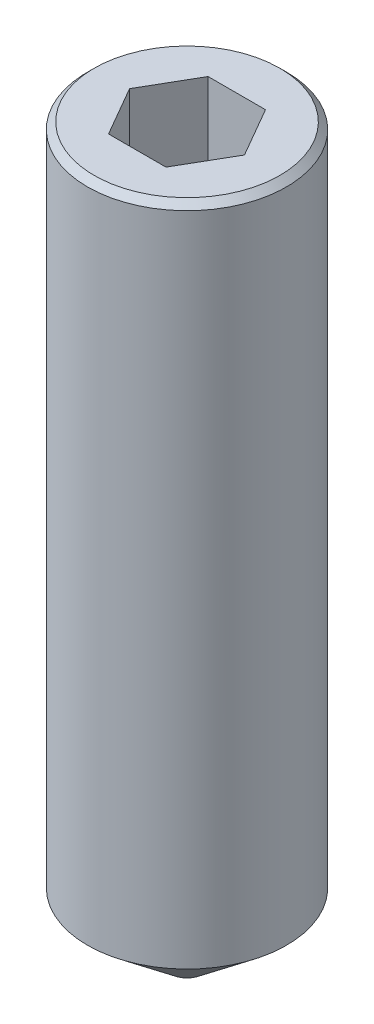
ISO-10303-21;
HEADER;
FILE_DESCRIPTION(('STEP AP214'),'2;1');
FILE_NAME('part.step','',(''),(''),'','','');
FILE_SCHEMA(('AUTOMOTIVE_DESIGN { 1 0 10303 214 1 1 1 1 }'));
ENDSEC;
DATA;
#1=APPLICATION_CONTEXT('core data for automotive mechanical design processes');
#2=APPLICATION_PROTOCOL_DEFINITION('international standard','automotive_design',2000,#1);
#3=PRODUCT_CONTEXT('',#1,'mechanical');
#4=PRODUCT('Part','Part','',(#3));
#5=PRODUCT_RELATED_PRODUCT_CATEGORY('part','',(#4));
#6=PRODUCT_DEFINITION_FORMATION('','',#4);
#7=PRODUCT_DEFINITION_CONTEXT('part definition',#1,'design');
#8=PRODUCT_DEFINITION('design','',#6,#7);
#9=PRODUCT_DEFINITION_SHAPE('','',#8);
#10=(LENGTH_UNIT() NAMED_UNIT(*) SI_UNIT(.MILLI.,.METRE.));
#11=(NAMED_UNIT(*) PLANE_ANGLE_UNIT() SI_UNIT($,.RADIAN.));
#12=(NAMED_UNIT(*) SI_UNIT($,.STERADIAN.) SOLID_ANGLE_UNIT());
#13=UNCERTAINTY_MEASURE_WITH_UNIT(LENGTH_MEASURE(1.E-05),#10,'distance_accuracy_value','');
#14=(GEOMETRIC_REPRESENTATION_CONTEXT(3) GLOBAL_UNCERTAINTY_ASSIGNED_CONTEXT((#13)) GLOBAL_UNIT_ASSIGNED_CONTEXT((#10,
#11,#12)) REPRESENTATION_CONTEXT('',''));
#15=CARTESIAN_POINT('',(0.,0.,0.));
#16=DIRECTION('',(0.,0.,1.));
#17=DIRECTION('',(1.,0.,0.));
#18=AXIS2_PLACEMENT_3D('',#15,#16,#17);
#19=CARTESIAN_POINT('',(0.,0.,0.));
#20=DIRECTION('',(0.,-1.,0.));
#21=DIRECTION('',(0.,0.,-1.));
#22=AXIS2_PLACEMENT_3D('',#19,#20,#21);
#23=PLANE('',#22);
#24=CARTESIAN_POINT('',(0.,0.,0.));
#25=DIRECTION('',(0.,-1.,0.));
#26=DIRECTION('',(0.,0.,-1.));
#27=AXIS2_PLACEMENT_3D('',#24,#25,#26);
#28=CIRCLE('',#27,1.40000000000001);
#29=CARTESIAN_POINT('',(0.,0.,-1.40000000000001));
#30=VERTEX_POINT('',#29);
#31=EDGE_CURVE('E43',#30,#30,#28,.F.);
#32=ORIENTED_EDGE('',*,*,#31,.T.);
#33=EDGE_LOOP('',(#32));
#34=FACE_BOUND('',#33,.T.);
#35=DIRECTION('',(1.,0.,0.));
#36=VECTOR('',#35,1.);
#37=CARTESIAN_POINT('',(-0.433012701892219,0.,0.75));
#38=LINE('',#37,#36);
#39=CARTESIAN_POINT('',(-0.433012701892219,0.,0.75));
#40=VERTEX_POINT('',#39);
#41=CARTESIAN_POINT('',(0.433012701892219,0.,0.75));
#42=VERTEX_POINT('',#41);
#43=EDGE_CURVE('E124',#40,#42,#38,.T.);
#44=ORIENTED_EDGE('',*,*,#43,.F.);
#45=DIRECTION('',(0.5,0.,0.866025403784438));
#46=VECTOR('',#45,1.);
#47=CARTESIAN_POINT('',(-0.866025403784439,0.,0.));
#48=LINE('',#47,#46);
#49=CARTESIAN_POINT('',(-0.866025403784439,0.,0.));
#50=VERTEX_POINT('',#49);
#51=EDGE_CURVE('E50',#50,#40,#48,.T.);
#52=ORIENTED_EDGE('',*,*,#51,.F.);
#53=DIRECTION('',(-0.5,0.,0.866025403784439));
#54=VECTOR('',#53,1.);
#55=CARTESIAN_POINT('',(-0.433012701892219,0.,-0.75));
#56=LINE('',#55,#54);
#57=CARTESIAN_POINT('',(-0.433012701892219,0.,-0.75));
#58=VERTEX_POINT('',#57);
#59=EDGE_CURVE('E133',#58,#50,#56,.T.);
#60=ORIENTED_EDGE('',*,*,#59,.F.);
#61=DIRECTION('',(-1.,0.,0.));
#62=VECTOR('',#61,1.);
#63=CARTESIAN_POINT('',(0.433012701892219,0.,-0.75));
#64=LINE('',#63,#62);
#65=CARTESIAN_POINT('',(0.433012701892219,0.,-0.75));
#66=VERTEX_POINT('',#65);
#67=EDGE_CURVE('E131',#66,#58,#64,.T.);
#68=ORIENTED_EDGE('',*,*,#67,.F.);
#69=DIRECTION('',(-0.5,0.,-0.866025403784439));
#70=VECTOR('',#69,1.);
#71=CARTESIAN_POINT('',(0.866025403784438,0.,0.));
#72=LINE('',#71,#70);
#73=CARTESIAN_POINT('',(0.866025403784438,0.,0.));
#74=VERTEX_POINT('',#73);
#75=EDGE_CURVE('E98',#74,#66,#72,.T.);
#76=ORIENTED_EDGE('',*,*,#75,.F.);
#77=DIRECTION('',(0.5,0.,-0.866025403784439));
#78=VECTOR('',#77,1.);
#79=CARTESIAN_POINT('',(0.433012701892219,0.,0.75));
#80=LINE('',#79,#78);
#81=EDGE_CURVE('E127',#42,#74,#80,.T.);
#82=ORIENTED_EDGE('',*,*,#81,.F.);
#83=EDGE_LOOP('',(#44,#52,#60,#68,#76,#82));
#84=FACE_BOUND('',#83,.T.);
#85=ADVANCED_FACE('F35',(#34,#84),#23,.F.);
#86=CARTESIAN_POINT('',(0.,8.71350028878554,0.));
#87=DIRECTION('',(0.,1.,0.));
#88=DIRECTION('',(0.,0.,1.));
#89=AXIS2_PLACEMENT_3D('',#86,#87,#88);
#90=CYLINDRICAL_SURFACE('',#89,1.5);
#91=CARTESIAN_POINT('',(0.,-0.0999999999999959,0.));
#92=DIRECTION('',(0.,-1.,0.));
#93=DIRECTION('',(0.,0.,-1.));
#94=AXIS2_PLACEMENT_3D('',#91,#92,#93);
#95=CIRCLE('',#94,1.5);
#96=CARTESIAN_POINT('',(0.,-0.0999999999999959,-1.5));
#97=VERTEX_POINT('',#96);
#98=EDGE_CURVE('E11',#97,#97,#95,.T.);
#99=ORIENTED_EDGE('',*,*,#98,.T.);
#100=EDGE_LOOP('',(#99));
#101=FACE_BOUND('',#100,.T.);
#102=CARTESIAN_POINT('',(0.,-10.,0.));
#103=DIRECTION('',(0.,1.,0.));
#104=DIRECTION('',(0.,0.,1.));
#105=AXIS2_PLACEMENT_3D('',#102,#103,#104);
#106=CIRCLE('',#105,1.5);
#107=CARTESIAN_POINT('',(0.,-10.,1.5));
#108=VERTEX_POINT('',#107);
#109=EDGE_CURVE('E145',#108,#108,#106,.T.);
#110=ORIENTED_EDGE('',*,*,#109,.T.);
#111=EDGE_LOOP('',(#110));
#112=FACE_BOUND('',#111,.T.);
#113=ADVANCED_FACE('F161',(#101,#112),#90,.T.);
#114=CARTESIAN_POINT('',(0.,-11.,0.));
#115=DIRECTION('',(0.,1.,0.));
#116=DIRECTION('',(0.,0.,1.));
#117=AXIS2_PLACEMENT_3D('',#114,#115,#116);
#118=CONICAL_SURFACE('',#117,0.250000000000002,0.896055384571344);
#119=CARTESIAN_POINT('',(0.,-11.,0.));
#120=DIRECTION('',(0.,1.,0.));
#121=DIRECTION('',(0.,0.,1.));
#122=AXIS2_PLACEMENT_3D('',#119,#120,#121);
#123=CIRCLE('',#122,0.250000000000002);
#124=CARTESIAN_POINT('',(0.,-11.,0.250000000000001));
#125=VERTEX_POINT('',#124);
#126=EDGE_CURVE('E137',#125,#125,#123,.T.);
#127=CARTESIAN_POINT('',(0.,-10.,1.5));
#128=CARTESIAN_POINT('',(0.,-10.0104166666667,1.48697916666667));
#129=CARTESIAN_POINT('',(0.,-10.0208333333333,1.47395833333334));
#130=CARTESIAN_POINT('',(0.,-10.0416666666667,1.44791666666667));
#131=CARTESIAN_POINT('',(0.,-10.0520833333333,1.43489583333333));
#132=CARTESIAN_POINT('',(0.,-10.0729166666667,1.40885416666667));
#133=CARTESIAN_POINT('',(0.,-10.0833333333333,1.39583333333333));
#134=CARTESIAN_POINT('',(0.,-10.1041666666667,1.36979166666667));
#135=CARTESIAN_POINT('',(0.,-10.1145833333333,1.35677083333333));
#136=CARTESIAN_POINT('',(0.,-10.1354166666667,1.33072916666667));
#137=CARTESIAN_POINT('',(0.,-10.1458333333333,1.31770833333333));
#138=CARTESIAN_POINT('',(0.,-10.1666666666667,1.29166666666667));
#139=CARTESIAN_POINT('',(0.,-10.1770833333333,1.27864583333334));
#140=CARTESIAN_POINT('',(0.,-10.1979166666667,1.25260416666667));
#141=CARTESIAN_POINT('',(0.,-10.2083333333333,1.23958333333334));
#142=CARTESIAN_POINT('',(0.,-10.2291666666667,1.21354166666667));
#143=CARTESIAN_POINT('',(0.,-10.2395833333333,1.20052083333333));
#144=CARTESIAN_POINT('',(0.,-10.2604166666667,1.17447916666667));
#145=CARTESIAN_POINT('',(0.,-10.2708333333333,1.16145833333333));
#146=CARTESIAN_POINT('',(0.,-10.2916666666667,1.13541666666667));
#147=CARTESIAN_POINT('',(0.,-10.3020833333333,1.12239583333333));
#148=CARTESIAN_POINT('',(0.,-10.3229166666667,1.09635416666667));
#149=CARTESIAN_POINT('',(0.,-10.3333333333333,1.08333333333333));
#150=CARTESIAN_POINT('',(0.,-10.3541666666667,1.05729166666667));
#151=CARTESIAN_POINT('',(0.,-10.3645833333333,1.04427083333334));
#152=CARTESIAN_POINT('',(0.,-10.3854166666667,1.01822916666667));
#153=CARTESIAN_POINT('',(0.,-10.3958333333333,1.00520833333334));
#154=CARTESIAN_POINT('',(0.,-10.4166666666667,0.979166666666668));
#155=CARTESIAN_POINT('',(0.,-10.4270833333333,0.966145833333335));
#156=CARTESIAN_POINT('',(0.,-10.4479166666667,0.940104166666668));
#157=CARTESIAN_POINT('',(0.,-10.4583333333333,0.927083333333335));
#158=CARTESIAN_POINT('',(0.,-10.4791666666667,0.901041666666668));
#159=CARTESIAN_POINT('',(0.,-10.4895833333333,0.888020833333335));
#160=CARTESIAN_POINT('',(0.,-10.5104166666667,0.861979166666668));
#161=CARTESIAN_POINT('',(0.,-10.5208333333333,0.848958333333335));
#162=CARTESIAN_POINT('',(0.,-10.5416666666667,0.822916666666668));
#163=CARTESIAN_POINT('',(0.,-10.5520833333333,0.809895833333335));
#164=CARTESIAN_POINT('',(0.,-10.5729166666667,0.783854166666668));
#165=CARTESIAN_POINT('',(0.,-10.5833333333333,0.770833333333335));
#166=CARTESIAN_POINT('',(0.,-10.6041666666667,0.744791666666668));
#167=CARTESIAN_POINT('',(0.,-10.6145833333333,0.731770833333335));
#168=CARTESIAN_POINT('',(0.,-10.6354166666667,0.705729166666668));
#169=CARTESIAN_POINT('',(0.,-10.6458333333333,0.692708333333335));
#170=CARTESIAN_POINT('',(0.,-10.6666666666667,0.666666666666668));
#171=CARTESIAN_POINT('',(0.,-10.6770833333333,0.653645833333335));
#172=CARTESIAN_POINT('',(0.,-10.6979166666667,0.627604166666668));
#173=CARTESIAN_POINT('',(0.,-10.7083333333333,0.614583333333335));
#174=CARTESIAN_POINT('',(0.,-10.7291666666667,0.588541666666668));
#175=CARTESIAN_POINT('',(0.,-10.7395833333333,0.575520833333335));
#176=CARTESIAN_POINT('',(0.,-10.7604166666667,0.549479166666668));
#177=CARTESIAN_POINT('',(0.,-10.7708333333333,0.536458333333335));
#178=CARTESIAN_POINT('',(0.,-10.7916666666667,0.510416666666668));
#179=CARTESIAN_POINT('',(0.,-10.8020833333333,0.497395833333335));
#180=CARTESIAN_POINT('',(0.,-10.8229166666667,0.471354166666668));
#181=CARTESIAN_POINT('',(0.,-10.8333333333333,0.458333333333335));
#182=CARTESIAN_POINT('',(0.,-10.8541666666667,0.432291666666668));
#183=CARTESIAN_POINT('',(0.,-10.8645833333333,0.419270833333335));
#184=CARTESIAN_POINT('',(0.,-10.8854166666667,0.393229166666668));
#185=CARTESIAN_POINT('',(0.,-10.8958333333333,0.380208333333335));
#186=CARTESIAN_POINT('',(0.,-10.9166666666667,0.354166666666668));
#187=CARTESIAN_POINT('',(0.,-10.9270833333333,0.341145833333335));
#188=CARTESIAN_POINT('',(0.,-10.9479166666667,0.315104166666668));
#189=CARTESIAN_POINT('',(0.,-10.9583333333333,0.302083333333335));
#190=CARTESIAN_POINT('',(0.,-10.9791666666667,0.276041666666668));
#191=CARTESIAN_POINT('',(0.,-10.9895833333333,0.263020833333335));
#192=CARTESIAN_POINT('',(0.,-11.,0.250000000000001));
#193=B_SPLINE_CURVE_WITH_KNOTS('',3,(#127,#128,#129,#130,#131,#132,#133,#134,#135,#136,#137,
#138,#139,#140,#141,#142,#143,#144,#145,#146,#147,#148,#149,#150,#151,#152,#153,#154,#155,#156,
#157,#158,#159,#160,#161,#162,#163,#164,#165,#166,#167,#168,#169,#170,#171,#172,#173,#174,#175,
#176,#177,#178,#179,#180,#181,#182,#183,#184,#185,#186,#187,#188,#189,#190,#191,#192),
.UNSPECIFIED.,.F.,.F.,(4,2,2,2,2,2,2,2,2,2,2,2,2,2,2,2,2,2,2,2,2,2,2,2,2,2,2,2,2,2,2,2,4),(0.,
0.0500244081049442,0.100048816209888,0.150073224314833,0.200097632419777,0.250122040524721,
0.300146448629665,0.350170856734609,0.400195264839553,0.450219672944497,0.500244081049442,
0.550268489154386,0.60029289725933,0.650317305364274,0.700341713469218,0.750366121574163,
0.800390529679107,0.850414937784051,0.900439345888995,0.950463753993939,1.00048816209888,
1.05051257020383,1.10053697830877,1.15056138641372,1.20058579451866,1.2506102026236,
1.30063461072855,1.35065901883349,1.40068342693844,1.45070783504338,1.50073224314833,
1.55075665125327,1.60078105935821),.UNSPECIFIED.);
#194=EDGE_CURVE('BSEAM165',#108,#125,#193,.T.);
#195=ORIENTED_EDGE('',*,*,#109,.F.);
#196=ORIENTED_EDGE('',*,*,#126,.T.);
#197=ORIENTED_EDGE('',*,*,#194,.T.);
#198=ORIENTED_EDGE('',*,*,#194,.F.);
#199=EDGE_LOOP('',(#195,#197,#196,#198));
#200=FACE_BOUND('',#199,.T.);
#201=ADVANCED_FACE('F165',(#200),#118,.T.);
#202=CARTESIAN_POINT('',(0.250000000000002,-11.,0.));
#203=DIRECTION('',(0.,1.,0.));
#204=DIRECTION('',(0.,0.,1.));
#205=AXIS2_PLACEMENT_3D('',#202,#203,#204);
#206=PLANE('',#205);
#207=ORIENTED_EDGE('',*,*,#126,.F.);
#208=EDGE_LOOP('',(#207));
#209=FACE_BOUND('',#208,.T.);
#210=ADVANCED_FACE('F171',(#209),#206,.F.);
#211=CARTESIAN_POINT('',(-0.866025403784439,-1.5,0.));
#212=DIRECTION('',(-0.866025403784438,0.,0.5));
#213=DIRECTION('',(0.5,0.,0.866025403784438));
#214=AXIS2_PLACEMENT_3D('',#211,#212,#213);
#215=PLANE('',#214);
#216=ORIENTED_EDGE('',*,*,#51,.T.);
#217=DIRECTION('',(0.,1.,0.));
#218=VECTOR('',#217,1.);
#219=CARTESIAN_POINT('',(-0.433012701892219,-1.5,0.75));
#220=LINE('',#219,#218);
#221=CARTESIAN_POINT('',(-0.433012701892219,-1.5,0.75));
#222=VERTEX_POINT('',#221);
#223=EDGE_CURVE('E80',#222,#40,#220,.T.);
#224=ORIENTED_EDGE('',*,*,#223,.F.);
#225=DIRECTION('',(0.5,0.,0.866025403784438));
#226=VECTOR('',#225,1.);
#227=CARTESIAN_POINT('',(-0.866025403784439,-1.5,0.));
#228=LINE('',#227,#226);
#229=CARTESIAN_POINT('',(-0.866025403784439,-1.5,0.));
#230=VERTEX_POINT('',#229);
#231=EDGE_CURVE('E135',#230,#222,#228,.T.);
#232=ORIENTED_EDGE('',*,*,#231,.F.);
#233=DIRECTION('',(0.,1.,0.));
#234=VECTOR('',#233,1.);
#235=CARTESIAN_POINT('',(-0.866025403784439,-1.5,0.));
#236=LINE('',#235,#234);
#237=EDGE_CURVE('E58',#230,#50,#236,.T.);
#238=ORIENTED_EDGE('',*,*,#237,.T.);
#239=EDGE_LOOP('',(#216,#224,#232,#238));
#240=FACE_BOUND('',#239,.T.);
#241=ADVANCED_FACE('F175',(#240),#215,.F.);
#242=CARTESIAN_POINT('',(-0.433012701892219,-1.5,-0.75));
#243=DIRECTION('',(-0.866025403784439,0.,-0.5));
#244=DIRECTION('',(-0.5,0.,0.866025403784439));
#245=AXIS2_PLACEMENT_3D('',#242,#243,#244);
#246=PLANE('',#245);
#247=ORIENTED_EDGE('',*,*,#59,.T.);
#248=ORIENTED_EDGE('',*,*,#237,.F.);
#249=DIRECTION('',(-0.5,0.,0.866025403784439));
#250=VECTOR('',#249,1.);
#251=CARTESIAN_POINT('',(-0.433012701892219,-1.5,-0.75));
#252=LINE('',#251,#250);
#253=CARTESIAN_POINT('',(-0.433012701892219,-1.5,-0.75));
#254=VERTEX_POINT('',#253);
#255=EDGE_CURVE('E110',#254,#230,#252,.T.);
#256=ORIENTED_EDGE('',*,*,#255,.F.);
#257=DIRECTION('',(0.,1.,0.));
#258=VECTOR('',#257,1.);
#259=CARTESIAN_POINT('',(-0.433012701892219,-1.5,-0.75));
#260=LINE('',#259,#258);
#261=EDGE_CURVE('E102',#254,#58,#260,.T.);
#262=ORIENTED_EDGE('',*,*,#261,.T.);
#263=EDGE_LOOP('',(#247,#248,#256,#262));
#264=FACE_BOUND('',#263,.T.);
#265=ADVANCED_FACE('F179',(#264),#246,.F.);
#266=CARTESIAN_POINT('',(0.433012701892219,-1.5,-0.75));
#267=DIRECTION('',(0.,0.,-1.));
#268=DIRECTION('',(-1.,0.,0.));
#269=AXIS2_PLACEMENT_3D('',#266,#267,#268);
#270=PLANE('',#269);
#271=ORIENTED_EDGE('',*,*,#67,.T.);
#272=ORIENTED_EDGE('',*,*,#261,.F.);
#273=DIRECTION('',(-1.,0.,0.));
#274=VECTOR('',#273,1.);
#275=CARTESIAN_POINT('',(0.433012701892219,-1.5,-0.75));
#276=LINE('',#275,#274);
#277=CARTESIAN_POINT('',(0.433012701892219,-1.5,-0.75));
#278=VERTEX_POINT('',#277);
#279=EDGE_CURVE('E106',#278,#254,#276,.T.);
#280=ORIENTED_EDGE('',*,*,#279,.F.);
#281=DIRECTION('',(0.,1.,0.));
#282=VECTOR('',#281,1.);
#283=CARTESIAN_POINT('',(0.433012701892219,-1.5,-0.75));
#284=LINE('',#283,#282);
#285=EDGE_CURVE('E91',#278,#66,#284,.T.);
#286=ORIENTED_EDGE('',*,*,#285,.T.);
#287=EDGE_LOOP('',(#271,#272,#280,#286));
#288=FACE_BOUND('',#287,.T.);
#289=ADVANCED_FACE('F107',(#288),#270,.F.);
#290=CARTESIAN_POINT('',(0.866025403784438,-1.5,0.));
#291=DIRECTION('',(0.866025403784438,0.,-0.5));
#292=DIRECTION('',(-0.5,0.,-0.866025403784439));
#293=AXIS2_PLACEMENT_3D('',#290,#291,#292);
#294=PLANE('',#293);
#295=ORIENTED_EDGE('',*,*,#75,.T.);
#296=ORIENTED_EDGE('',*,*,#285,.F.);
#297=DIRECTION('',(-0.5,0.,-0.866025403784439));
#298=VECTOR('',#297,1.);
#299=CARTESIAN_POINT('',(0.866025403784438,-1.5,0.));
#300=LINE('',#299,#298);
#301=CARTESIAN_POINT('',(0.866025403784438,-1.5,0.));
#302=VERTEX_POINT('',#301);
#303=EDGE_CURVE('E95',#302,#278,#300,.T.);
#304=ORIENTED_EDGE('',*,*,#303,.F.);
#305=DIRECTION('',(0.,1.,0.));
#306=VECTOR('',#305,1.);
#307=CARTESIAN_POINT('',(0.866025403784438,-1.5,0.));
#308=LINE('',#307,#306);
#309=EDGE_CURVE('E103',#302,#74,#308,.T.);
#310=ORIENTED_EDGE('',*,*,#309,.T.);
#311=EDGE_LOOP('',(#295,#296,#304,#310));
#312=FACE_BOUND('',#311,.T.);
#313=ADVANCED_FACE('F93',(#312),#294,.F.);
#314=CARTESIAN_POINT('',(0.433012701892219,-1.5,0.75));
#315=DIRECTION('',(0.866025403784439,0.,0.5));
#316=DIRECTION('',(0.5,0.,-0.866025403784439));
#317=AXIS2_PLACEMENT_3D('',#314,#315,#316);
#318=PLANE('',#317);
#319=ORIENTED_EDGE('',*,*,#81,.T.);
#320=ORIENTED_EDGE('',*,*,#309,.F.);
#321=DIRECTION('',(0.5,0.,-0.866025403784439));
#322=VECTOR('',#321,1.);
#323=CARTESIAN_POINT('',(0.433012701892219,-1.5,0.75));
#324=LINE('',#323,#322);
#325=CARTESIAN_POINT('',(0.433012701892219,-1.5,0.75));
#326=VERTEX_POINT('',#325);
#327=EDGE_CURVE('E116',#326,#302,#324,.T.);
#328=ORIENTED_EDGE('',*,*,#327,.F.);
#329=DIRECTION('',(0.,1.,0.));
#330=VECTOR('',#329,1.);
#331=CARTESIAN_POINT('',(0.433012701892219,-1.5,0.75));
#332=LINE('',#331,#330);
#333=EDGE_CURVE('E140',#326,#42,#332,.T.);
#334=ORIENTED_EDGE('',*,*,#333,.T.);
#335=EDGE_LOOP('',(#319,#320,#328,#334));
#336=FACE_BOUND('',#335,.T.);
#337=ADVANCED_FACE('F182',(#336),#318,.F.);
#338=CARTESIAN_POINT('',(-0.433012701892219,-1.5,0.75));
#339=DIRECTION('',(0.,0.,1.));
#340=DIRECTION('',(1.,0.,0.));
#341=AXIS2_PLACEMENT_3D('',#338,#339,#340);
#342=PLANE('',#341);
#343=ORIENTED_EDGE('',*,*,#43,.T.);
#344=ORIENTED_EDGE('',*,*,#333,.F.);
#345=DIRECTION('',(1.,0.,0.));
#346=VECTOR('',#345,1.);
#347=CARTESIAN_POINT('',(-0.433012701892219,-1.5,0.75));
#348=LINE('',#347,#346);
#349=EDGE_CURVE('E118',#222,#326,#348,.T.);
#350=ORIENTED_EDGE('',*,*,#349,.F.);
#351=ORIENTED_EDGE('',*,*,#223,.T.);
#352=EDGE_LOOP('',(#343,#344,#350,#351));
#353=FACE_BOUND('',#352,.T.);
#354=ADVANCED_FACE('F157',(#353),#342,.F.);
#355=CARTESIAN_POINT('',(0.,-1.5,0.));
#356=DIRECTION('',(0.,1.,0.));
#357=DIRECTION('',(0.,0.,1.));
#358=AXIS2_PLACEMENT_3D('',#355,#356,#357);
#359=PLANE('',#358);
#360=ORIENTED_EDGE('',*,*,#231,.T.);
#361=ORIENTED_EDGE('',*,*,#349,.T.);
#362=ORIENTED_EDGE('',*,*,#327,.T.);
#363=ORIENTED_EDGE('',*,*,#303,.T.);
#364=ORIENTED_EDGE('',*,*,#279,.T.);
#365=ORIENTED_EDGE('',*,*,#255,.T.);
#366=EDGE_LOOP('',(#360,#361,#362,#363,#364,#365));
#367=FACE_BOUND('',#366,.T.);
#368=ADVANCED_FACE('F113',(#367),#359,.T.);
#369=CARTESIAN_POINT('',(0.,0.,0.));
#370=DIRECTION('',(0.,-1.,0.));
#371=DIRECTION('',(0.,0.,-1.));
#372=AXIS2_PLACEMENT_3D('',#369,#370,#371);
#373=CONICAL_SURFACE('',#372,1.40000000000001,0.785398163397447);
#374=ORIENTED_EDGE('',*,*,#98,.F.);
#375=EDGE_LOOP('',(#374));
#376=FACE_BOUND('',#375,.T.);
#377=ORIENTED_EDGE('',*,*,#31,.F.);
#378=EDGE_LOOP('',(#377));
#379=FACE_BOUND('',#378,.T.);
#380=ADVANCED_FACE('F37',(#376,#379),#373,.T.);
#381=CLOSED_SHELL('',(#85,#113,#201,#210,#241,#265,#289,#313,#337,#354,#368,#380));
#382=MANIFOLD_SOLID_BREP('B2',#381);
#383=ADVANCED_BREP_SHAPE_REPRESENTATION('',(#18,#382),#14);
#384=SHAPE_DEFINITION_REPRESENTATION(#9,#383);
ENDSEC;
END-ISO-10303-21;
